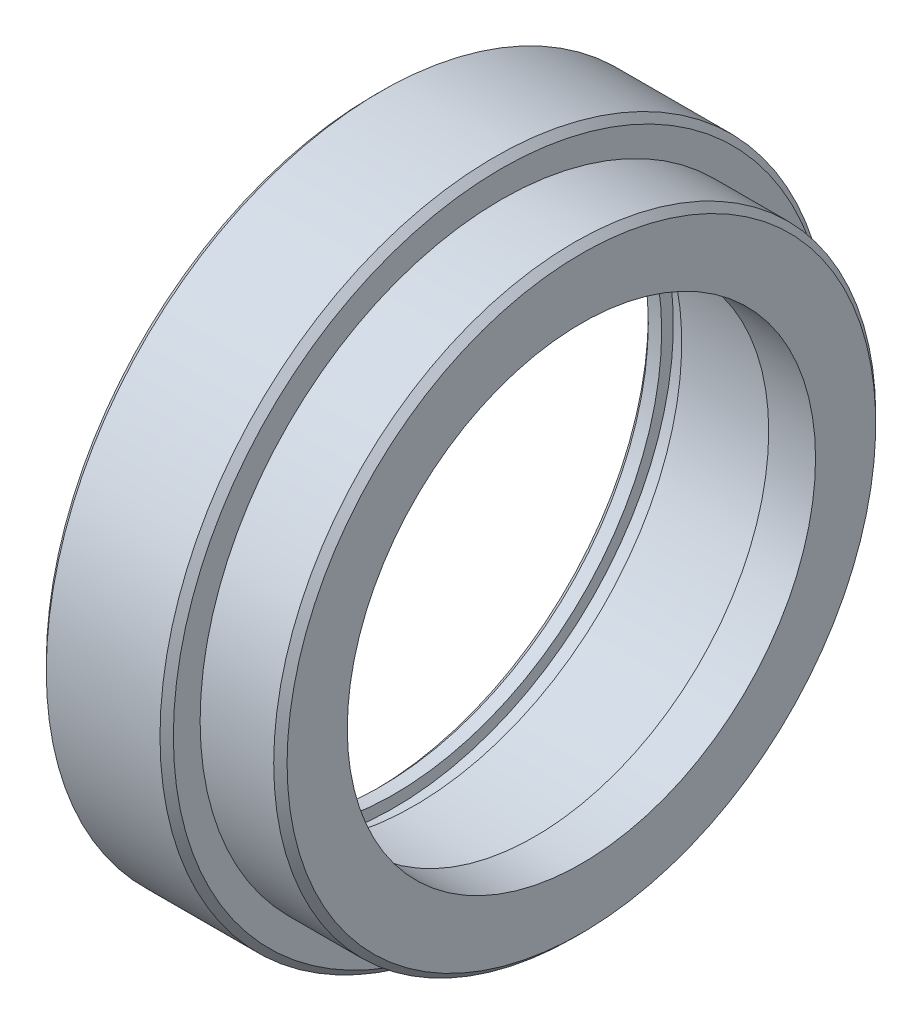
ISO-10303-21;
HEADER;
FILE_DESCRIPTION(('STEP AP214'),'2;1');
FILE_NAME('part.step','',(''),(''),'','','');
FILE_SCHEMA(('AUTOMOTIVE_DESIGN { 1 0 10303 214 1 1 1 1 }'));
ENDSEC;
DATA;
#1=APPLICATION_CONTEXT('core data for automotive mechanical design processes');
#2=APPLICATION_PROTOCOL_DEFINITION('international standard','automotive_design',2000,#1);
#3=PRODUCT_CONTEXT('',#1,'mechanical');
#4=PRODUCT('Part','Part','',(#3));
#5=PRODUCT_RELATED_PRODUCT_CATEGORY('part','',(#4));
#6=PRODUCT_DEFINITION_FORMATION('','',#4);
#7=PRODUCT_DEFINITION_CONTEXT('part definition',#1,'design');
#8=PRODUCT_DEFINITION('design','',#6,#7);
#9=PRODUCT_DEFINITION_SHAPE('','',#8);
#10=(LENGTH_UNIT() NAMED_UNIT(*) SI_UNIT(.MILLI.,.METRE.));
#11=(NAMED_UNIT(*) PLANE_ANGLE_UNIT() SI_UNIT($,.RADIAN.));
#12=(NAMED_UNIT(*) SI_UNIT($,.STERADIAN.) SOLID_ANGLE_UNIT());
#13=UNCERTAINTY_MEASURE_WITH_UNIT(LENGTH_MEASURE(1.E-05),#10,'distance_accuracy_value','');
#14=(GEOMETRIC_REPRESENTATION_CONTEXT(3) GLOBAL_UNCERTAINTY_ASSIGNED_CONTEXT((#13)) GLOBAL_UNIT_ASSIGNED_CONTEXT((#10,
#11,#12)) REPRESENTATION_CONTEXT('',''));
#15=CARTESIAN_POINT('',(0.,0.,0.));
#16=DIRECTION('',(0.,0.,1.));
#17=DIRECTION('',(1.,0.,0.));
#18=AXIS2_PLACEMENT_3D('',#15,#16,#17);
#19=CARTESIAN_POINT('',(0.,0.,0.));
#20=DIRECTION('',(-1.,0.,0.));
#21=DIRECTION('',(0.,0.,1.));
#22=AXIS2_PLACEMENT_3D('',#19,#20,#21);
#23=CYLINDRICAL_SURFACE('',#22,40.);
#24=CARTESIAN_POINT('',(24.,0.,0.));
#25=DIRECTION('',(-1.,0.,0.));
#26=DIRECTION('',(0.,0.,1.));
#27=AXIS2_PLACEMENT_3D('',#24,#25,#26);
#28=CIRCLE('',#27,40.);
#29=CARTESIAN_POINT('',(24.,0.,40.));
#30=VERTEX_POINT('',#29);
#31=EDGE_CURVE('E93',#30,#30,#28,.T.);
#32=ORIENTED_EDGE('',*,*,#31,.F.);
#33=EDGE_LOOP('',(#32));
#34=FACE_BOUND('',#33,.T.);
#35=CARTESIAN_POINT('',(6.,0.,0.));
#36=DIRECTION('',(-1.,0.,0.));
#37=DIRECTION('',(0.,0.,1.));
#38=AXIS2_PLACEMENT_3D('',#35,#36,#37);
#39=CIRCLE('',#38,40.);
#40=CARTESIAN_POINT('',(6.,0.,40.));
#41=VERTEX_POINT('',#40);
#42=EDGE_CURVE('E50',#41,#41,#39,.F.);
#43=ORIENTED_EDGE('',*,*,#42,.F.);
#44=EDGE_LOOP('',(#43));
#45=FACE_BOUND('',#44,.T.);
#46=ADVANCED_FACE('F45',(#34,#45),#23,.F.);
#47=CARTESIAN_POINT('',(0.999999999999981,0.,0.));
#48=DIRECTION('',(1.,0.,0.));
#49=DIRECTION('',(0.,0.,-1.));
#50=AXIS2_PLACEMENT_3D('',#47,#48,#49);
#51=CIRCLE('',#50,40.);
#52=CARTESIAN_POINT('',(0.999999999999981,0.,-40.));
#53=VERTEX_POINT('',#52);
#54=EDGE_CURVE('E117',#53,#53,#51,.F.);
#55=ORIENTED_EDGE('',*,*,#54,.T.);
#56=EDGE_LOOP('',(#55));
#57=FACE_BOUND('',#56,.T.);
#58=CARTESIAN_POINT('',(3.,0.,0.));
#59=DIRECTION('',(1.,0.,0.));
#60=DIRECTION('',(0.,0.,-1.));
#61=AXIS2_PLACEMENT_3D('',#58,#59,#60);
#62=CIRCLE('',#61,40.);
#63=CARTESIAN_POINT('',(3.,0.,-40.));
#64=VERTEX_POINT('',#63);
#65=EDGE_CURVE('E65',#64,#64,#62,.F.);
#66=ORIENTED_EDGE('',*,*,#65,.F.);
#67=EDGE_LOOP('',(#66));
#68=FACE_BOUND('',#67,.T.);
#69=ADVANCED_FACE('F149',(#57,#68),#23,.F.);
#70=CARTESIAN_POINT('',(0.,0.,0.));
#71=DIRECTION('',(-1.,0.,0.));
#72=DIRECTION('',(0.,0.,1.));
#73=AXIS2_PLACEMENT_3D('',#70,#71,#72);
#74=CYLINDRICAL_SURFACE('',#73,45.);
#75=CARTESIAN_POINT('',(30.,0.,0.));
#76=DIRECTION('',(-1.,0.,0.));
#77=DIRECTION('',(0.,0.,1.));
#78=AXIS2_PLACEMENT_3D('',#75,#76,#77);
#79=CIRCLE('',#78,45.);
#80=CARTESIAN_POINT('',(30.,0.,45.));
#81=VERTEX_POINT('',#80);
#82=EDGE_CURVE('E55',#81,#81,#79,.T.);
#83=ORIENTED_EDGE('',*,*,#82,.T.);
#84=EDGE_LOOP('',(#83));
#85=FACE_BOUND('',#84,.T.);
#86=CARTESIAN_POINT('',(19.,0.,0.));
#87=DIRECTION('',(-1.,0.,0.));
#88=DIRECTION('',(0.,0.,1.));
#89=AXIS2_PLACEMENT_3D('',#86,#87,#88);
#90=CIRCLE('',#89,45.);
#91=CARTESIAN_POINT('',(19.,0.,45.));
#92=VERTEX_POINT('',#91);
#93=EDGE_CURVE('E97',#92,#92,#90,.T.);
#94=ORIENTED_EDGE('',*,*,#93,.F.);
#95=EDGE_LOOP('',(#94));
#96=FACE_BOUND('',#95,.T.);
#97=ADVANCED_FACE('F146',(#85,#96),#74,.T.);
#98=CARTESIAN_POINT('',(19.,45.,0.));
#99=DIRECTION('',(-1.,0.,0.));
#100=DIRECTION('',(0.,0.,1.));
#101=AXIS2_PLACEMENT_3D('',#98,#99,#100);
#102=PLANE('',#101);
#103=CARTESIAN_POINT('',(19.,0.,0.));
#104=DIRECTION('',(-1.,0.,0.));
#105=DIRECTION('',(0.,0.,1.));
#106=AXIS2_PLACEMENT_3D('',#103,#104,#105);
#107=CIRCLE('',#106,49.);
#108=CARTESIAN_POINT('',(19.,0.,49.));
#109=VERTEX_POINT('',#108);
#110=EDGE_CURVE('E62',#109,#109,#107,.F.);
#111=ORIENTED_EDGE('',*,*,#110,.T.);
#112=EDGE_LOOP('',(#111));
#113=FACE_BOUND('',#112,.T.);
#114=ORIENTED_EDGE('',*,*,#93,.T.);
#115=EDGE_LOOP('',(#114));
#116=FACE_BOUND('',#115,.T.);
#117=ADVANCED_FACE('F125',(#113,#116),#102,.F.);
#118=CARTESIAN_POINT('',(0.,0.,0.));
#119=DIRECTION('',(-1.,0.,0.));
#120=DIRECTION('',(0.,0.,1.));
#121=AXIS2_PLACEMENT_3D('',#118,#119,#120);
#122=CYLINDRICAL_SURFACE('',#121,50.);
#123=CARTESIAN_POINT('',(1.00000000000002,0.,0.));
#124=DIRECTION('',(1.,0.,0.));
#125=DIRECTION('',(0.,0.,-1.));
#126=AXIS2_PLACEMENT_3D('',#123,#124,#125);
#127=CIRCLE('',#126,50.);
#128=CARTESIAN_POINT('',(1.00000000000002,0.,-50.));
#129=VERTEX_POINT('',#128);
#130=EDGE_CURVE('E113',#129,#129,#127,.T.);
#131=ORIENTED_EDGE('',*,*,#130,.T.);
#132=EDGE_LOOP('',(#131));
#133=FACE_BOUND('',#132,.T.);
#134=CARTESIAN_POINT('',(18.,0.,0.));
#135=DIRECTION('',(-1.,0.,0.));
#136=DIRECTION('',(0.,0.,1.));
#137=AXIS2_PLACEMENT_3D('',#134,#135,#136);
#138=CIRCLE('',#137,50.);
#139=CARTESIAN_POINT('',(18.,0.,50.));
#140=VERTEX_POINT('',#139);
#141=EDGE_CURVE('E109',#140,#140,#138,.T.);
#142=ORIENTED_EDGE('',*,*,#141,.T.);
#143=EDGE_LOOP('',(#142));
#144=FACE_BOUND('',#143,.T.);
#145=ADVANCED_FACE('F134',(#133,#144),#122,.T.);
#146=CARTESIAN_POINT('',(0.,40.,0.));
#147=DIRECTION('',(1.,0.,0.));
#148=DIRECTION('',(0.,0.,-1.));
#149=AXIS2_PLACEMENT_3D('',#146,#147,#148);
#150=PLANE('',#149);
#151=CARTESIAN_POINT('',(0.,0.,0.));
#152=DIRECTION('',(1.,0.,0.));
#153=DIRECTION('',(0.,0.,-1.));
#154=AXIS2_PLACEMENT_3D('',#151,#152,#153);
#155=CIRCLE('',#154,49.);
#156=CARTESIAN_POINT('',(0.,0.,-49.));
#157=VERTEX_POINT('',#156);
#158=EDGE_CURVE('E105',#157,#157,#155,.F.);
#159=ORIENTED_EDGE('',*,*,#158,.T.);
#160=EDGE_LOOP('',(#159));
#161=FACE_BOUND('',#160,.T.);
#162=CARTESIAN_POINT('',(0.,0.,0.));
#163=DIRECTION('',(1.,0.,0.));
#164=DIRECTION('',(0.,0.,-1.));
#165=AXIS2_PLACEMENT_3D('',#162,#163,#164);
#166=CIRCLE('',#165,41.);
#167=CARTESIAN_POINT('',(0.,0.,-41.));
#168=VERTEX_POINT('',#167);
#169=EDGE_CURVE('E101',#168,#168,#166,.T.);
#170=ORIENTED_EDGE('',*,*,#169,.T.);
#171=EDGE_LOOP('',(#170));
#172=FACE_BOUND('',#171,.T.);
#173=ADVANCED_FACE('F136',(#161,#172),#150,.F.);
#174=CARTESIAN_POINT('',(24.,35.,0.));
#175=DIRECTION('',(1.,0.,0.));
#176=DIRECTION('',(0.,0.,-1.));
#177=AXIS2_PLACEMENT_3D('',#174,#175,#176);
#178=PLANE('',#177);
#179=CARTESIAN_POINT('',(24.,0.,0.));
#180=DIRECTION('',(-1.,0.,0.));
#181=DIRECTION('',(0.,0.,1.));
#182=AXIS2_PLACEMENT_3D('',#179,#180,#181);
#183=CIRCLE('',#182,35.);
#184=CARTESIAN_POINT('',(24.,0.,35.));
#185=VERTEX_POINT('',#184);
#186=EDGE_CURVE('E89',#185,#185,#183,.T.);
#187=ORIENTED_EDGE('',*,*,#186,.F.);
#188=EDGE_LOOP('',(#187));
#189=FACE_BOUND('',#188,.T.);
#190=ORIENTED_EDGE('',*,*,#31,.T.);
#191=EDGE_LOOP('',(#190));
#192=FACE_BOUND('',#191,.T.);
#193=ADVANCED_FACE('F143',(#189,#192),#178,.F.);
#194=CARTESIAN_POINT('',(0.,0.,0.));
#195=DIRECTION('',(-1.,0.,0.));
#196=DIRECTION('',(0.,0.,1.));
#197=AXIS2_PLACEMENT_3D('',#194,#195,#196);
#198=CYLINDRICAL_SURFACE('',#197,35.);
#199=CARTESIAN_POINT('',(31.,0.,0.));
#200=DIRECTION('',(-1.,0.,0.));
#201=DIRECTION('',(0.,0.,1.));
#202=AXIS2_PLACEMENT_3D('',#199,#200,#201);
#203=CIRCLE('',#202,35.);
#204=CARTESIAN_POINT('',(31.,0.,35.));
#205=VERTEX_POINT('',#204);
#206=EDGE_CURVE('E75',#205,#205,#203,.T.);
#207=ORIENTED_EDGE('',*,*,#206,.F.);
#208=EDGE_LOOP('',(#207));
#209=FACE_BOUND('',#208,.T.);
#210=ORIENTED_EDGE('',*,*,#186,.T.);
#211=EDGE_LOOP('',(#210));
#212=FACE_BOUND('',#211,.T.);
#213=ADVANCED_FACE('F162',(#209,#212),#198,.F.);
#214=CARTESIAN_POINT('',(31.,35.,0.));
#215=DIRECTION('',(-1.,0.,0.));
#216=DIRECTION('',(0.,0.,1.));
#217=AXIS2_PLACEMENT_3D('',#214,#215,#216);
#218=PLANE('',#217);
#219=CARTESIAN_POINT('',(31.,0.,0.));
#220=DIRECTION('',(-1.,0.,0.));
#221=DIRECTION('',(0.,0.,1.));
#222=AXIS2_PLACEMENT_3D('',#219,#220,#221);
#223=CIRCLE('',#222,44.);
#224=CARTESIAN_POINT('',(31.,0.,44.));
#225=VERTEX_POINT('',#224);
#226=EDGE_CURVE('E10',#225,#225,#223,.F.);
#227=ORIENTED_EDGE('',*,*,#226,.T.);
#228=EDGE_LOOP('',(#227));
#229=FACE_BOUND('',#228,.T.);
#230=ORIENTED_EDGE('',*,*,#206,.T.);
#231=EDGE_LOOP('',(#230));
#232=FACE_BOUND('',#231,.T.);
#233=ADVANCED_FACE('F166',(#229,#232),#218,.F.);
#234=CARTESIAN_POINT('',(0.,0.,0.));
#235=DIRECTION('',(1.,0.,0.));
#236=DIRECTION('',(0.,0.,-1.));
#237=AXIS2_PLACEMENT_3D('',#234,#235,#236);
#238=CONICAL_SURFACE('',#237,49.,0.785398163397445);
#239=ORIENTED_EDGE('',*,*,#130,.F.);
#240=EDGE_LOOP('',(#239));
#241=FACE_BOUND('',#240,.T.);
#242=ORIENTED_EDGE('',*,*,#158,.F.);
#243=EDGE_LOOP('',(#242));
#244=FACE_BOUND('',#243,.T.);
#245=ADVANCED_FACE('F170',(#241,#244),#238,.T.);
#246=CARTESIAN_POINT('',(0.999999999999981,0.,0.));
#247=DIRECTION('',(-1.,0.,0.));
#248=DIRECTION('',(0.,0.,1.));
#249=AXIS2_PLACEMENT_3D('',#246,#247,#248);
#250=CONICAL_SURFACE('',#249,40.,0.785398163397455);
#251=ORIENTED_EDGE('',*,*,#169,.F.);
#252=EDGE_LOOP('',(#251));
#253=FACE_BOUND('',#252,.T.);
#254=ORIENTED_EDGE('',*,*,#54,.F.);
#255=EDGE_LOOP('',(#254));
#256=FACE_BOUND('',#255,.T.);
#257=ADVANCED_FACE('F131',(#253,#256),#250,.F.);
#258=CARTESIAN_POINT('',(18.,0.,0.));
#259=DIRECTION('',(-1.,0.,0.));
#260=DIRECTION('',(0.,0.,1.));
#261=AXIS2_PLACEMENT_3D('',#258,#259,#260);
#262=CONICAL_SURFACE('',#261,50.,0.785398163397455);
#263=ORIENTED_EDGE('',*,*,#110,.F.);
#264=EDGE_LOOP('',(#263));
#265=FACE_BOUND('',#264,.T.);
#266=ORIENTED_EDGE('',*,*,#141,.F.);
#267=EDGE_LOOP('',(#266));
#268=FACE_BOUND('',#267,.T.);
#269=ADVANCED_FACE('F128',(#265,#268),#262,.T.);
#270=CARTESIAN_POINT('',(30.,0.,0.));
#271=DIRECTION('',(-1.,0.,0.));
#272=DIRECTION('',(0.,0.,1.));
#273=AXIS2_PLACEMENT_3D('',#270,#271,#272);
#274=CONICAL_SURFACE('',#273,45.,0.785398163397448);
#275=ORIENTED_EDGE('',*,*,#226,.F.);
#276=EDGE_LOOP('',(#275));
#277=FACE_BOUND('',#276,.T.);
#278=ORIENTED_EDGE('',*,*,#82,.F.);
#279=EDGE_LOOP('',(#278));
#280=FACE_BOUND('',#279,.T.);
#281=ADVANCED_FACE('F48',(#277,#280),#274,.T.);
#282=CARTESIAN_POINT('',(6.,41.75,0.));
#283=DIRECTION('',(-1.,0.,0.));
#284=DIRECTION('',(0.,0.,1.));
#285=AXIS2_PLACEMENT_3D('',#282,#283,#284);
#286=PLANE('',#285);
#287=CARTESIAN_POINT('',(5.99999999999999,0.,0.));
#288=DIRECTION('',(-1.,0.,0.));
#289=DIRECTION('',(0.,0.,1.));
#290=AXIS2_PLACEMENT_3D('',#287,#288,#289);
#291=CIRCLE('',#290,41.75);
#292=CARTESIAN_POINT('',(5.99999999999999,0.,41.75));
#293=VERTEX_POINT('',#292);
#294=EDGE_CURVE('E77',#293,#293,#291,.T.);
#295=ORIENTED_EDGE('',*,*,#294,.T.);
#296=EDGE_LOOP('',(#295));
#297=FACE_BOUND('',#296,.T.);
#298=ORIENTED_EDGE('',*,*,#42,.T.);
#299=EDGE_LOOP('',(#298));
#300=FACE_BOUND('',#299,.T.);
#301=ADVANCED_FACE('F171',(#297,#300),#286,.T.);
#302=CARTESIAN_POINT('',(3.,41.75,0.));
#303=DIRECTION('',(1.,0.,0.));
#304=DIRECTION('',(0.,0.,-1.));
#305=AXIS2_PLACEMENT_3D('',#302,#303,#304);
#306=PLANE('',#305);
#307=CARTESIAN_POINT('',(2.99999999999999,0.,0.));
#308=DIRECTION('',(-1.,0.,0.));
#309=DIRECTION('',(0.,0.,1.));
#310=AXIS2_PLACEMENT_3D('',#307,#308,#309);
#311=CIRCLE('',#310,41.75);
#312=CARTESIAN_POINT('',(2.99999999999999,0.,41.75));
#313=VERTEX_POINT('',#312);
#314=EDGE_CURVE('E68',#313,#313,#311,.T.);
#315=ORIENTED_EDGE('',*,*,#314,.F.);
#316=EDGE_LOOP('',(#315));
#317=FACE_BOUND('',#316,.T.);
#318=ORIENTED_EDGE('',*,*,#65,.T.);
#319=EDGE_LOOP('',(#318));
#320=FACE_BOUND('',#319,.T.);
#321=ADVANCED_FACE('F174',(#317,#320),#306,.T.);
#322=CARTESIAN_POINT('',(0.,0.,0.));
#323=DIRECTION('',(-1.,0.,0.));
#324=DIRECTION('',(0.,0.,1.));
#325=AXIS2_PLACEMENT_3D('',#322,#323,#324);
#326=CYLINDRICAL_SURFACE('',#325,41.75);
#327=ORIENTED_EDGE('',*,*,#314,.T.);
#328=EDGE_LOOP('',(#327));
#329=FACE_BOUND('',#328,.T.);
#330=ORIENTED_EDGE('',*,*,#294,.F.);
#331=EDGE_LOOP('',(#330));
#332=FACE_BOUND('',#331,.T.);
#333=ADVANCED_FACE('F178',(#329,#332),#326,.F.);
#334=CLOSED_SHELL('',(#46,#69,#97,#117,#145,#173,#193,#213,#233,#245,#257,#269,#281,#301,#321,#333));
#335=MANIFOLD_SOLID_BREP('B2',#334);
#336=ADVANCED_BREP_SHAPE_REPRESENTATION('',(#18,#335),#14);
#337=SHAPE_DEFINITION_REPRESENTATION(#9,#336);
ENDSEC;
END-ISO-10303-21;
